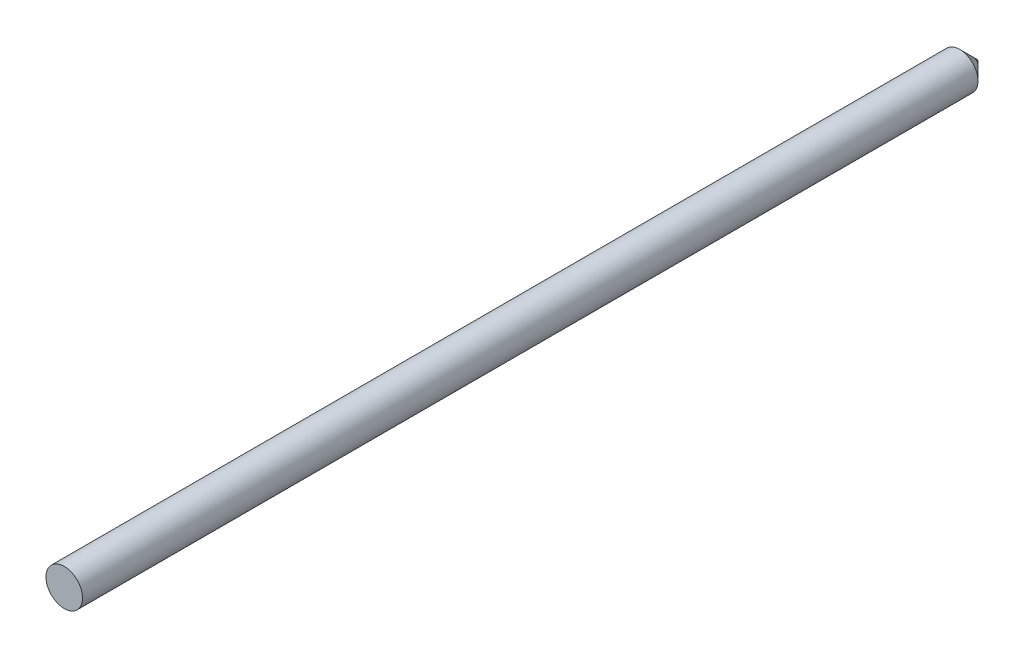
ISO-10303-21;
HEADER;
FILE_DESCRIPTION(('STEP AP214'),'2;1');
FILE_NAME('part.step','',(''),(''),'','','');
FILE_SCHEMA(('AUTOMOTIVE_DESIGN { 1 0 10303 214 1 1 1 1 }'));
ENDSEC;
DATA;
#1=APPLICATION_CONTEXT('core data for automotive mechanical design processes');
#2=APPLICATION_PROTOCOL_DEFINITION('international standard','automotive_design',2000,#1);
#3=PRODUCT_CONTEXT('',#1,'mechanical');
#4=PRODUCT('Part','Part','',(#3));
#5=PRODUCT_RELATED_PRODUCT_CATEGORY('part','',(#4));
#6=PRODUCT_DEFINITION_FORMATION('','',#4);
#7=PRODUCT_DEFINITION_CONTEXT('part definition',#1,'design');
#8=PRODUCT_DEFINITION('design','',#6,#7);
#9=PRODUCT_DEFINITION_SHAPE('','',#8);
#10=(LENGTH_UNIT() NAMED_UNIT(*) SI_UNIT(.MILLI.,.METRE.));
#11=(NAMED_UNIT(*) PLANE_ANGLE_UNIT() SI_UNIT($,.RADIAN.));
#12=(NAMED_UNIT(*) SI_UNIT($,.STERADIAN.) SOLID_ANGLE_UNIT());
#13=UNCERTAINTY_MEASURE_WITH_UNIT(LENGTH_MEASURE(1.E-05),#10,'distance_accuracy_value','');
#14=(GEOMETRIC_REPRESENTATION_CONTEXT(3) GLOBAL_UNCERTAINTY_ASSIGNED_CONTEXT((#13)) GLOBAL_UNIT_ASSIGNED_CONTEXT((#10,
#11,#12)) REPRESENTATION_CONTEXT('',''));
#15=CARTESIAN_POINT('',(0.,0.,0.));
#16=DIRECTION('',(0.,0.,1.));
#17=DIRECTION('',(1.,0.,0.));
#18=AXIS2_PLACEMENT_3D('',#15,#16,#17);
#19=CARTESIAN_POINT('',(0.,0.,76.2));
#20=DIRECTION('',(0.,0.,-1.));
#21=DIRECTION('',(-1.,0.,0.));
#22=AXIS2_PLACEMENT_3D('',#19,#20,#21);
#23=PLANE('',#22);
#24=CARTESIAN_POINT('',(0.,0.,76.2));
#25=DIRECTION('',(0.,0.,1.));
#26=DIRECTION('',(1.,0.,0.));
#27=AXIS2_PLACEMENT_3D('',#24,#25,#26);
#28=CIRCLE('',#27,1.524);
#29=CARTESIAN_POINT('',(1.524,0.,76.2));
#30=VERTEX_POINT('',#29);
#31=EDGE_CURVE('E19',#30,#30,#28,.F.);
#32=ORIENTED_EDGE('',*,*,#31,.F.);
#33=EDGE_LOOP('',(#32));
#34=FACE_BOUND('',#33,.T.);
#35=ADVANCED_FACE('F16',(#34),#23,.F.);
#36=CARTESIAN_POINT('',(0.,0.,1.52399999996078));
#37=DIRECTION('',(0.,0.,1.));
#38=DIRECTION('',(0.,-1.,0.));
#39=AXIS2_PLACEMENT_3D('',#36,#37,#38);
#40=CONICAL_SURFACE('',#39,1.52399999996078,0.785398163266902);
#41=CARTESIAN_POINT('',(1.13686837721616E-10,0.,-1.13686837721616E-10));
#42=VERTEX_POINT('',#41);
#43=VERTEX_LOOP('',#42);
#44=FACE_BOUND('',#43,.T.);
#45=CARTESIAN_POINT('',(0.,0.,1.524));
#46=DIRECTION('',(0.,0.,1.));
#47=DIRECTION('',(1.,0.,0.));
#48=AXIS2_PLACEMENT_3D('',#45,#46,#47);
#49=CIRCLE('',#48,1.524);
#50=CARTESIAN_POINT('',(1.524,0.,1.524));
#51=VERTEX_POINT('',#50);
#52=EDGE_CURVE('E10',#51,#51,#49,.T.);
#53=ORIENTED_EDGE('',*,*,#52,.F.);
#54=EDGE_LOOP('',(#53));
#55=FACE_BOUND('',#54,.T.);
#56=ADVANCED_FACE('F26',(#44,#55),#40,.T.);
#57=CARTESIAN_POINT('',(0.,0.,0.));
#58=DIRECTION('',(0.,0.,1.));
#59=DIRECTION('',(1.,0.,0.));
#60=AXIS2_PLACEMENT_3D('',#57,#58,#59);
#61=CYLINDRICAL_SURFACE('',#60,1.524);
#62=ORIENTED_EDGE('',*,*,#52,.T.);
#63=EDGE_LOOP('',(#62));
#64=FACE_BOUND('',#63,.T.);
#65=ORIENTED_EDGE('',*,*,#31,.T.);
#66=EDGE_LOOP('',(#65));
#67=FACE_BOUND('',#66,.T.);
#68=ADVANCED_FACE('F29',(#64,#67),#61,.T.);
#69=CLOSED_SHELL('',(#35,#56,#68));
#70=MANIFOLD_SOLID_BREP('B1',#69);
#71=ADVANCED_BREP_SHAPE_REPRESENTATION('',(#18,#70),#14);
#72=SHAPE_DEFINITION_REPRESENTATION(#9,#71);
ENDSEC;
END-ISO-10303-21;
